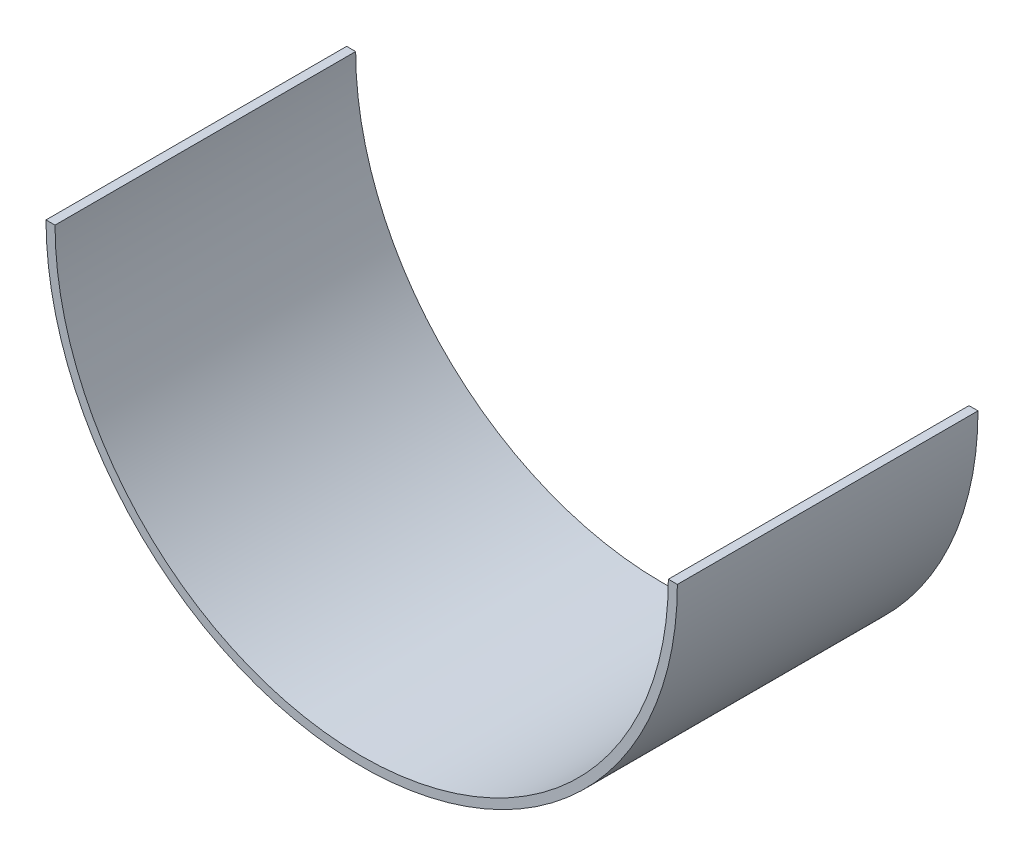
ISO-10303-21;
HEADER;
FILE_DESCRIPTION(('STEP AP214'),'2;1');
FILE_NAME('part.step','',(''),(''),'','','');
FILE_SCHEMA(('AUTOMOTIVE_DESIGN { 1 0 10303 214 1 1 1 1 }'));
ENDSEC;
DATA;
#1=APPLICATION_CONTEXT('core data for automotive mechanical design processes');
#2=APPLICATION_PROTOCOL_DEFINITION('international standard','automotive_design',2000,#1);
#3=PRODUCT_CONTEXT('',#1,'mechanical');
#4=PRODUCT('Part','Part','',(#3));
#5=PRODUCT_RELATED_PRODUCT_CATEGORY('part','',(#4));
#6=PRODUCT_DEFINITION_FORMATION('','',#4);
#7=PRODUCT_DEFINITION_CONTEXT('part definition',#1,'design');
#8=PRODUCT_DEFINITION('design','',#6,#7);
#9=PRODUCT_DEFINITION_SHAPE('','',#8);
#10=(LENGTH_UNIT() NAMED_UNIT(*) SI_UNIT(.MILLI.,.METRE.));
#11=(NAMED_UNIT(*) PLANE_ANGLE_UNIT() SI_UNIT($,.RADIAN.));
#12=(NAMED_UNIT(*) SI_UNIT($,.STERADIAN.) SOLID_ANGLE_UNIT());
#13=UNCERTAINTY_MEASURE_WITH_UNIT(LENGTH_MEASURE(1.E-05),#10,'distance_accuracy_value','');
#14=(GEOMETRIC_REPRESENTATION_CONTEXT(3) GLOBAL_UNCERTAINTY_ASSIGNED_CONTEXT((#13)) GLOBAL_UNIT_ASSIGNED_CONTEXT((#10,
#11,#12)) REPRESENTATION_CONTEXT('',''));
#15=CARTESIAN_POINT('',(0.,0.,0.));
#16=DIRECTION('',(0.,0.,1.));
#17=DIRECTION('',(1.,0.,0.));
#18=AXIS2_PLACEMENT_3D('',#15,#16,#17);
#19=CARTESIAN_POINT('',(0.,0.,50.));
#20=DIRECTION('',(0.,0.,-1.));
#21=DIRECTION('',(-1.,0.,0.));
#22=AXIS2_PLACEMENT_3D('',#19,#20,#21);
#23=CYLINDRICAL_SURFACE('',#22,52.5);
#24=CARTESIAN_POINT('',(0.,0.,50.));
#25=DIRECTION('',(0.,0.,1.));
#26=DIRECTION('',(1.,0.,0.));
#27=AXIS2_PLACEMENT_3D('',#24,#25,#26);
#28=CIRCLE('',#27,52.5);
#29=CARTESIAN_POINT('',(-52.5,0.,50.));
#30=VERTEX_POINT('',#29);
#31=CARTESIAN_POINT('',(52.5,0.,50.));
#32=VERTEX_POINT('',#31);
#33=EDGE_CURVE('E123',#30,#32,#28,.T.);
#34=ORIENTED_EDGE('',*,*,#33,.F.);
#35=DIRECTION('',(0.,0.,1.));
#36=VECTOR('',#35,1.);
#37=CARTESIAN_POINT('',(-52.5,0.,0.));
#38=LINE('',#37,#36);
#39=CARTESIAN_POINT('',(-52.5,0.,0.));
#40=VERTEX_POINT('',#39);
#41=EDGE_CURVE('E108',#40,#30,#38,.T.);
#42=ORIENTED_EDGE('',*,*,#41,.F.);
#43=CARTESIAN_POINT('',(0.,0.,0.));
#44=DIRECTION('',(0.,0.,1.));
#45=DIRECTION('',(1.,0.,0.));
#46=AXIS2_PLACEMENT_3D('',#43,#44,#45);
#47=CIRCLE('',#46,52.5);
#48=CARTESIAN_POINT('',(52.5,0.,0.));
#49=VERTEX_POINT('',#48);
#50=EDGE_CURVE('E116',#40,#49,#47,.T.);
#51=ORIENTED_EDGE('',*,*,#50,.T.);
#52=DIRECTION('',(0.,0.,1.));
#53=VECTOR('',#52,1.);
#54=CARTESIAN_POINT('',(52.5,0.,0.));
#55=LINE('',#54,#53);
#56=EDGE_CURVE('E99',#49,#32,#55,.T.);
#57=ORIENTED_EDGE('',*,*,#56,.T.);
#58=EDGE_LOOP('',(#34,#42,#51,#57));
#59=FACE_BOUND('',#58,.T.);
#60=ADVANCED_FACE('F61',(#59),#23,.T.);
#61=CARTESIAN_POINT('',(0.,0.,50.));
#62=DIRECTION('',(0.,0.,1.));
#63=DIRECTION('',(1.,0.,0.));
#64=AXIS2_PLACEMENT_3D('',#61,#62,#63);
#65=PLANE('',#64);
#66=DIRECTION('',(1.,0.,0.));
#67=VECTOR('',#66,1.);
#68=CARTESIAN_POINT('',(0.,0.,50.));
#69=LINE('',#68,#67);
#70=CARTESIAN_POINT('',(-51.,0.,50.));
#71=VERTEX_POINT('',#70);
#72=EDGE_CURVE('E76',#30,#71,#69,.T.);
#73=ORIENTED_EDGE('',*,*,#72,.F.);
#74=ORIENTED_EDGE('',*,*,#33,.T.);
#75=CARTESIAN_POINT('',(51.,0.,50.));
#76=VERTEX_POINT('',#75);
#77=EDGE_CURVE('E102',#76,#32,#69,.T.);
#78=ORIENTED_EDGE('',*,*,#77,.F.);
#79=CARTESIAN_POINT('',(0.,0.,50.));
#80=DIRECTION('',(0.,0.,1.));
#81=DIRECTION('',(1.,0.,0.));
#82=AXIS2_PLACEMENT_3D('',#79,#80,#81);
#83=CIRCLE('',#82,51.);
#84=EDGE_CURVE('E128',#71,#76,#83,.T.);
#85=ORIENTED_EDGE('',*,*,#84,.F.);
#86=EDGE_LOOP('',(#73,#74,#78,#85));
#87=FACE_BOUND('',#86,.T.);
#88=ADVANCED_FACE('F137',(#87),#65,.T.);
#89=CARTESIAN_POINT('',(0.,0.,0.));
#90=DIRECTION('',(0.,0.,1.));
#91=DIRECTION('',(1.,0.,0.));
#92=AXIS2_PLACEMENT_3D('',#89,#90,#91);
#93=PLANE('',#92);
#94=ORIENTED_EDGE('',*,*,#50,.F.);
#95=DIRECTION('',(1.,0.,0.));
#96=VECTOR('',#95,1.);
#97=CARTESIAN_POINT('',(0.,0.,0.));
#98=LINE('',#97,#96);
#99=CARTESIAN_POINT('',(-51.,0.,0.));
#100=VERTEX_POINT('',#99);
#101=EDGE_CURVE('E109',#40,#100,#98,.T.);
#102=ORIENTED_EDGE('',*,*,#101,.T.);
#103=CARTESIAN_POINT('',(0.,0.,0.));
#104=DIRECTION('',(0.,0.,1.));
#105=DIRECTION('',(1.,0.,0.));
#106=AXIS2_PLACEMENT_3D('',#103,#104,#105);
#107=CIRCLE('',#106,51.);
#108=CARTESIAN_POINT('',(51.,0.,0.));
#109=VERTEX_POINT('',#108);
#110=EDGE_CURVE('E118',#100,#109,#107,.T.);
#111=ORIENTED_EDGE('',*,*,#110,.T.);
#112=EDGE_CURVE('E84',#109,#49,#98,.T.);
#113=ORIENTED_EDGE('',*,*,#112,.T.);
#114=EDGE_LOOP('',(#94,#102,#111,#113));
#115=FACE_BOUND('',#114,.T.);
#116=ADVANCED_FACE('F114',(#115),#93,.F.);
#117=CARTESIAN_POINT('',(0.,0.,0.));
#118=DIRECTION('',(0.,0.,1.));
#119=DIRECTION('',(1.,0.,0.));
#120=AXIS2_PLACEMENT_3D('',#117,#118,#119);
#121=CYLINDRICAL_SURFACE('',#120,51.);
#122=ORIENTED_EDGE('',*,*,#84,.T.);
#123=DIRECTION('',(0.,0.,1.));
#124=VECTOR('',#123,1.);
#125=CARTESIAN_POINT('',(51.,0.,0.));
#126=LINE('',#125,#124);
#127=EDGE_CURVE('E12',#76,#109,#126,.F.);
#128=ORIENTED_EDGE('',*,*,#127,.T.);
#129=ORIENTED_EDGE('',*,*,#110,.F.);
#130=DIRECTION('',(0.,0.,1.));
#131=VECTOR('',#130,1.);
#132=CARTESIAN_POINT('',(-51.,0.,0.));
#133=LINE('',#132,#131);
#134=EDGE_CURVE('E69',#100,#71,#133,.T.);
#135=ORIENTED_EDGE('',*,*,#134,.T.);
#136=EDGE_LOOP('',(#122,#128,#129,#135));
#137=FACE_BOUND('',#136,.T.);
#138=ADVANCED_FACE('F135',(#137),#121,.F.);
#139=CARTESIAN_POINT('',(0.,0.,0.));
#140=DIRECTION('',(0.,-1.,0.));
#141=DIRECTION('',(0.,0.,-1.));
#142=AXIS2_PLACEMENT_3D('',#139,#140,#141);
#143=PLANE('',#142);
#144=ORIENTED_EDGE('',*,*,#101,.F.);
#145=ORIENTED_EDGE('',*,*,#41,.T.);
#146=ORIENTED_EDGE('',*,*,#72,.T.);
#147=ORIENTED_EDGE('',*,*,#134,.F.);
#148=EDGE_LOOP('',(#144,#145,#146,#147));
#149=FACE_BOUND('',#148,.T.);
#150=ADVANCED_FACE('F144',(#149),#143,.F.);
#151=ORIENTED_EDGE('',*,*,#77,.T.);
#152=ORIENTED_EDGE('',*,*,#56,.F.);
#153=ORIENTED_EDGE('',*,*,#112,.F.);
#154=ORIENTED_EDGE('',*,*,#127,.F.);
#155=EDGE_LOOP('',(#151,#152,#153,#154));
#156=FACE_BOUND('',#155,.T.);
#157=ADVANCED_FACE('F100',(#156),#143,.F.);
#158=CLOSED_SHELL('',(#60,#88,#116,#138,#150,#157));
#159=MANIFOLD_SOLID_BREP('B2',#158);
#160=ADVANCED_BREP_SHAPE_REPRESENTATION('',(#18,#159),#14);
#161=SHAPE_DEFINITION_REPRESENTATION(#9,#160);
ENDSEC;
END-ISO-10303-21;
